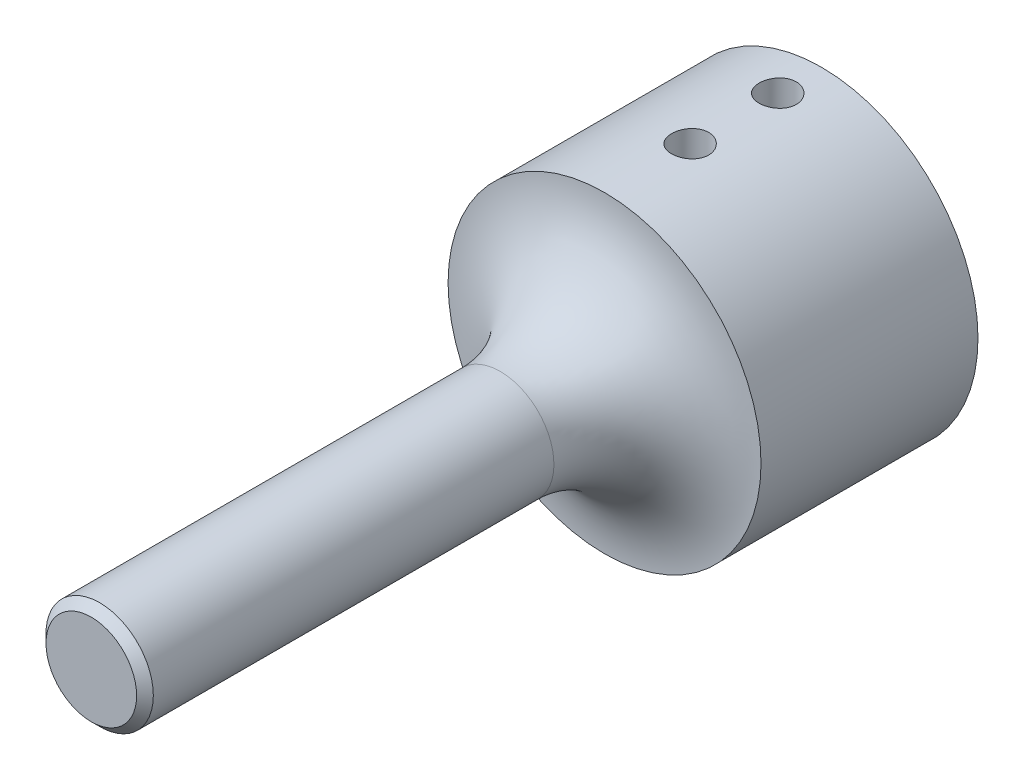
ISO-10303-21;
HEADER;
FILE_DESCRIPTION(('STEP AP214'),'2;1');
FILE_NAME('part.step','',(''),(''),'','','');
FILE_SCHEMA(('AUTOMOTIVE_DESIGN { 1 0 10303 214 1 1 1 1 }'));
ENDSEC;
DATA;
#1=APPLICATION_CONTEXT('core data for automotive mechanical design processes');
#2=APPLICATION_PROTOCOL_DEFINITION('international standard','automotive_design',2000,#1);
#3=PRODUCT_CONTEXT('',#1,'mechanical');
#4=PRODUCT('Part','Part','',(#3));
#5=PRODUCT_RELATED_PRODUCT_CATEGORY('part','',(#4));
#6=PRODUCT_DEFINITION_FORMATION('','',#4);
#7=PRODUCT_DEFINITION_CONTEXT('part definition',#1,'design');
#8=PRODUCT_DEFINITION('design','',#6,#7);
#9=PRODUCT_DEFINITION_SHAPE('','',#8);
#10=(LENGTH_UNIT() NAMED_UNIT(*) SI_UNIT(.MILLI.,.METRE.));
#11=(NAMED_UNIT(*) PLANE_ANGLE_UNIT() SI_UNIT($,.RADIAN.));
#12=(NAMED_UNIT(*) SI_UNIT($,.STERADIAN.) SOLID_ANGLE_UNIT());
#13=UNCERTAINTY_MEASURE_WITH_UNIT(LENGTH_MEASURE(1.E-05),#10,'distance_accuracy_value','');
#14=(GEOMETRIC_REPRESENTATION_CONTEXT(3) GLOBAL_UNCERTAINTY_ASSIGNED_CONTEXT((#13)) GLOBAL_UNIT_ASSIGNED_CONTEXT((#10,
#11,#12)) REPRESENTATION_CONTEXT('',''));
#15=CARTESIAN_POINT('',(0.,0.,0.));
#16=DIRECTION('',(0.,0.,1.));
#17=DIRECTION('',(1.,0.,0.));
#18=AXIS2_PLACEMENT_3D('',#15,#16,#17);
#19=CARTESIAN_POINT('',(-18.0514662573155,-10.8126357882277,-16.91054210806));
#20=DIRECTION('',(0.,0.,-1.));
#21=DIRECTION('',(0.,1.,0.));
#22=AXIS2_PLACEMENT_3D('',#19,#20,#21);
#23=CYLINDRICAL_SURFACE('',#22,9.525);
#24=CARTESIAN_POINT('',(-18.0514662573155,-1.28763578822773,-18.44724210806));
#25=CARTESIAN_POINT('',(-17.9882153197936,-1.28763663343585,-18.447244810517));
#26=CARTESIAN_POINT('',(-17.9249242275658,-1.28827248180843,-18.4525692313038));
#27=CARTESIAN_POINT('',(-17.8001014368434,-1.29074785101325,-18.4737263484268));
#28=CARTESIAN_POINT('',(-17.7385716754113,-1.29258864765316,-18.4895701830467));
#29=CARTESIAN_POINT('',(-17.6190968204405,-1.29726642317237,-18.5312942913642));
#30=CARTESIAN_POINT('',(-17.5611494103104,-1.30010275017836,-18.5571679986558));
#31=CARTESIAN_POINT('',(-17.4504308524692,-1.30645566631574,-18.6182034549146));
#32=CARTESIAN_POINT('',(-17.3976587806049,-1.30997213366083,-18.653363541469));
#33=CARTESIAN_POINT('',(-17.2985144343616,-1.31731196099756,-18.7321612070145));
#34=CARTESIAN_POINT('',(-17.2521716531665,-1.32113661578548,-18.7758357778217));
#35=CARTESIAN_POINT('',(-17.1674552669091,-1.32865124404931,-18.8703433268483));
#36=CARTESIAN_POINT('',(-17.1290820572934,-1.33234121083456,-18.9211766600725));
#37=CARTESIAN_POINT('',(-17.0612855537481,-1.33918151409459,-19.0287486932236));
#38=CARTESIAN_POINT('',(-17.0318896577375,-1.34233018605715,-19.0855047754408));
#39=CARTESIAN_POINT('',(-16.9830571792291,-1.34771454161614,-19.2031914387469));
#40=CARTESIAN_POINT('',(-16.9636202554845,-1.34995025649477,-19.2641218767194));
#41=CARTESIAN_POINT('',(-16.9353465537621,-1.35324333803794,-19.3881227823505));
#42=CARTESIAN_POINT('',(-16.9264601809845,-1.35430621615747,-19.4511817929043));
#43=CARTESIAN_POINT('',(-16.9193864115577,-1.35515020078602,-19.5779044060569));
#44=CARTESIAN_POINT('',(-16.9211986256806,-1.35493135392578,-19.6415679865765));
#45=CARTESIAN_POINT('',(-16.9354298328598,-1.35324165789509,-19.7673479666981));
#46=CARTESIAN_POINT('',(-16.9477943279195,-1.35177724168584,-19.829470631067));
#47=CARTESIAN_POINT('',(-16.9826941477497,-1.34777144491238,-19.9507529755792));
#48=CARTESIAN_POINT('',(-17.0052296599236,-1.34523004450453,-20.0099126011054));
#49=CARTESIAN_POINT('',(-17.0598908215646,-1.33934930322716,-20.1237596299982));
#50=CARTESIAN_POINT('',(-17.092040289182,-1.33600798474456,-20.1784354912851));
#51=CARTESIAN_POINT('',(-17.1649996978145,-1.32890545217908,-20.2816365165216));
#52=CARTESIAN_POINT('',(-17.2058099959676,-1.32514422078372,-20.3301614266986));
#53=CARTESIAN_POINT('',(-17.2952352866473,-1.31759703661084,-20.4199995298958));
#54=CARTESIAN_POINT('',(-17.3438972789469,-1.31381107568362,-20.461265952846));
#55=CARTESIAN_POINT('',(-17.4474824216774,-1.30666296915444,-20.5350519736082));
#56=CARTESIAN_POINT('',(-17.5024055842254,-1.3033008243727,-20.567571554492));
#57=CARTESIAN_POINT('',(-17.6169890650876,-1.29737737231467,-20.622940289348));
#58=CARTESIAN_POINT('',(-17.67665073749,-1.29481629499335,-20.6457866671883));
#59=CARTESIAN_POINT('',(-17.799000598783,-1.29078568548237,-20.6811241265642));
#60=CARTESIAN_POINT('',(-17.8616886599339,-1.2893161072649,-20.6936156447602));
#61=CARTESIAN_POINT('',(-17.9879072465489,-1.28764003929652,-20.7078285311502));
#62=CARTESIAN_POINT('',(-18.0514304173072,-1.2874259902572,-20.7096143575962));
#63=CARTESIAN_POINT('',(-18.1778708891652,-1.28826472654523,-20.7025350521886));
#64=CARTESIAN_POINT('',(-18.2407882018435,-1.28931748761396,-20.6936701242903));
#65=CARTESIAN_POINT('',(-18.3640419077389,-1.29256681601997,-20.6655944831271));
#66=CARTESIAN_POINT('',(-18.4243853641369,-1.29476000152513,-20.6464143529887));
#67=CARTESIAN_POINT('',(-18.5409990115921,-1.30004450792664,-20.5982844561384));
#68=CARTESIAN_POINT('',(-18.5972690768377,-1.3031358565491,-20.5693343878259));
#69=CARTESIAN_POINT('',(-18.7044274964864,-1.30989059125222,-20.5023293800957));
#70=CARTESIAN_POINT('',(-18.755289499798,-1.31355658053019,-20.4642325652899));
#71=CARTESIAN_POINT('',(-18.8499202847191,-1.32104194290352,-20.3800749529435));
#72=CARTESIAN_POINT('',(-18.8936888133888,-1.3248613214624,-20.3340138715332));
#73=CARTESIAN_POINT('',(-18.973117585297,-1.33224616329585,-20.2349520169174));
#74=CARTESIAN_POINT('',(-19.008735214628,-1.33581022804106,-20.1819169561492));
#75=CARTESIAN_POINT('',(-19.0705571391929,-1.34225834136365,-20.0705797375953));
#76=CARTESIAN_POINT('',(-19.0967616072111,-1.34514240242259,-20.0122776765134));
#77=CARTESIAN_POINT('',(-19.1389437222468,-1.34989462430631,-19.8922012983206));
#78=CARTESIAN_POINT('',(-19.1549457581781,-1.35176520623118,-19.8304356487656));
#79=CARTESIAN_POINT('',(-19.1763474829373,-1.35428576046631,-19.7050704814088));
#80=CARTESIAN_POINT('',(-19.1817476125448,-1.35493578352187,-19.6414710399593));
#81=CARTESIAN_POINT('',(-19.1817846904457,-1.35494024853987,-19.5146674655561));
#82=CARTESIAN_POINT('',(-19.1764885818454,-1.35430274854945,-19.4514633419564));
#83=CARTESIAN_POINT('',(-19.1554248971346,-1.35182128191016,-19.3268500942845));
#84=CARTESIAN_POINT('',(-19.139657316609,-1.34997731475262,-19.2654409709691));
#85=CARTESIAN_POINT('',(-19.0981185504269,-1.34529310315644,-19.1461674749464));
#86=CARTESIAN_POINT('',(-19.0723502522068,-1.34245314630564,-19.0883020846602));
#87=CARTESIAN_POINT('',(-19.0115481460035,-1.33609643994807,-18.9777061340658));
#88=CARTESIAN_POINT('',(-18.9765142674556,-1.33257968528701,-18.9249756128678));
#89=CARTESIAN_POINT('',(-18.8979261337611,-1.32523924693353,-18.8258036817852));
#90=CARTESIAN_POINT('',(-18.8543219554093,-1.32141384623853,-18.7794019579957));
#91=CARTESIAN_POINT('',(-18.7599342083051,-1.3139024689342,-18.6945477638902));
#92=CARTESIAN_POINT('',(-18.7091489425004,-1.31021652554352,-18.6560971779109));
#93=CARTESIAN_POINT('',(-18.6016421325572,-1.30338553671744,-18.5881259455954));
#94=CARTESIAN_POINT('',(-18.5449007645963,-1.30024239599414,-18.5586364798392));
#95=CARTESIAN_POINT('',(-18.4272669888281,-1.29487074360418,-18.5096457634046));
#96=CARTESIAN_POINT('',(-18.3663792219865,-1.29264122834002,-18.4901335470647));
#97=CARTESIAN_POINT('',(-18.2628843721093,-1.28989176006893,-18.4663755659465));
#98=CARTESIAN_POINT('',(-18.2209325569325,-1.28904984331134,-18.4592106899935));
#99=CARTESIAN_POINT('',(-18.1364819591754,-1.28792157509874,-18.4496430680201));
#100=CARTESIAN_POINT('',(-18.0939831801019,-1.28763522008361,-18.4472402914837));
#101=CARTESIAN_POINT('',(-18.0514662573155,-1.28763578822773,-18.44724210806));
#102=B_SPLINE_CURVE_WITH_KNOTS('',3,(#24,#25,#26,#27,#28,#29,#30,#31,#32,#33,#34,#35,#36,#37,
#38,#39,#40,#41,#42,#43,#44,#45,#46,#47,#48,#49,#50,#51,#52,#53,#54,#55,#56,#57,#58,#59,#60,#61,
#62,#63,#64,#65,#66,#67,#68,#69,#70,#71,#72,#73,#74,#75,#76,#77,#78,#79,#80,#81,#82,#83,#84,#85,
#86,#87,#88,#89,#90,#91,#92,#93,#94,#95,#96,#97,#98,#99,#100,#101),.UNSPECIFIED.,.T.,.F.,(4,2,2,
2,2,2,2,2,2,2,2,2,2,2,2,2,2,2,2,2,2,2,2,2,2,2,2,2,2,2,2,2,2,2,2,2,2,2,4),(0.,0.189597524312163,
0.379396121234883,0.56907066916994,0.75871128526545,0.949194948105548,1.13968806040505,
1.33075686013229,1.52181911239724,1.71197964005891,1.90213324948718,2.09131069927981,
2.28049163485501,2.4701451964838,2.65980658018673,2.8506485273792,3.04149084391374,
3.232387893604,3.4232768928326,3.61301539850876,3.80275027087081,3.99192568241037,
4.18110693437604,4.37117138460746,4.56124261068453,4.75228593782411,4.94332575806604,
5.13390716820241,5.32448065465381,5.51386512071869,5.70324966663246,5.89257957351564,
6.08191092233626,6.27237971236643,6.4628935899097,6.65406297150348,6.8450217911509,
6.97246899232318,7.09991537679581),.UNSPECIFIED.);
#103=CARTESIAN_POINT('',(-18.0514662573155,-1.28763578822773,-18.44724210806));
#104=VERTEX_POINT('',#103);
#105=EDGE_CURVE('E87',#104,#104,#102,.T.);
#106=ORIENTED_EDGE('',*,*,#105,.F.);
#107=EDGE_LOOP('',(#106));
#108=FACE_BOUND('',#107,.T.);
#109=CARTESIAN_POINT('',(-18.0514662573155,-1.28763578822773,-23.78124210806));
#110=CARTESIAN_POINT('',(-17.9882153197936,-1.28763663343585,-23.781244810517));
#111=CARTESIAN_POINT('',(-17.9249242275658,-1.28827248180843,-23.7865692313038));
#112=CARTESIAN_POINT('',(-17.8001014368434,-1.29074785101325,-23.8077263484268));
#113=CARTESIAN_POINT('',(-17.7385716754113,-1.29258864765316,-23.8235701830467));
#114=CARTESIAN_POINT('',(-17.6190968204405,-1.29726642317237,-23.8652942913642));
#115=CARTESIAN_POINT('',(-17.5611494103104,-1.30010275017836,-23.8911679986558));
#116=CARTESIAN_POINT('',(-17.4504308524692,-1.30645566631574,-23.9522034549146));
#117=CARTESIAN_POINT('',(-17.3976587806049,-1.30997213366083,-23.987363541469));
#118=CARTESIAN_POINT('',(-17.2985144343616,-1.31731196099756,-24.0661612070145));
#119=CARTESIAN_POINT('',(-17.2521716531665,-1.32113661578548,-24.1098357778217));
#120=CARTESIAN_POINT('',(-17.1674552669091,-1.32865124404931,-24.2043433268482));
#121=CARTESIAN_POINT('',(-17.1290820572934,-1.33234121083456,-24.2551766600725));
#122=CARTESIAN_POINT('',(-17.0612855537481,-1.33918151409459,-24.3627486932236));
#123=CARTESIAN_POINT('',(-17.0318896577375,-1.34233018605715,-24.4195047754408));
#124=CARTESIAN_POINT('',(-16.9830571792291,-1.34771454161614,-24.5371914387469));
#125=CARTESIAN_POINT('',(-16.9636202554845,-1.34995025649477,-24.5981218767194));
#126=CARTESIAN_POINT('',(-16.9353465537621,-1.35324333803794,-24.7221227823505));
#127=CARTESIAN_POINT('',(-16.9264601809845,-1.35430621615747,-24.7851817929043));
#128=CARTESIAN_POINT('',(-16.9193864115577,-1.35515020078602,-24.9119044060569));
#129=CARTESIAN_POINT('',(-16.9211986256806,-1.35493135392578,-24.9755679865765));
#130=CARTESIAN_POINT('',(-16.9354298328598,-1.35324165789509,-25.1013479666981));
#131=CARTESIAN_POINT('',(-16.9477943279195,-1.35177724168584,-25.163470631067));
#132=CARTESIAN_POINT('',(-16.9826941477497,-1.34777144491238,-25.2847529755791));
#133=CARTESIAN_POINT('',(-17.0052296599236,-1.34523004450453,-25.3439126011054));
#134=CARTESIAN_POINT('',(-17.0598908215646,-1.33934930322716,-25.4577596299982));
#135=CARTESIAN_POINT('',(-17.092040289182,-1.33600798474456,-25.5124354912851));
#136=CARTESIAN_POINT('',(-17.1649996978145,-1.32890545217908,-25.6156365165216));
#137=CARTESIAN_POINT('',(-17.2058099959676,-1.32514422078372,-25.6641614266986));
#138=CARTESIAN_POINT('',(-17.2952352866473,-1.31759703661084,-25.7539995298958));
#139=CARTESIAN_POINT('',(-17.3438972789469,-1.31381107568362,-25.795265952846));
#140=CARTESIAN_POINT('',(-17.4474824216774,-1.30666296915444,-25.8690519736082));
#141=CARTESIAN_POINT('',(-17.5024055842254,-1.3033008243727,-25.901571554492));
#142=CARTESIAN_POINT('',(-17.6169890650876,-1.29737737231467,-25.956940289348));
#143=CARTESIAN_POINT('',(-17.67665073749,-1.29481629499335,-25.9797866671883));
#144=CARTESIAN_POINT('',(-17.799000598783,-1.29078568548237,-26.0151241265642));
#145=CARTESIAN_POINT('',(-17.8616886599339,-1.2893161072649,-26.0276156447602));
#146=CARTESIAN_POINT('',(-17.9879072465489,-1.28764003929652,-26.0418285311502));
#147=CARTESIAN_POINT('',(-18.0514304173072,-1.2874259902572,-26.0436143575962));
#148=CARTESIAN_POINT('',(-18.1778708891652,-1.28826472654523,-26.0365350521886));
#149=CARTESIAN_POINT('',(-18.2407882018435,-1.28931748761396,-26.0276701242903));
#150=CARTESIAN_POINT('',(-18.3640419077389,-1.29256681601997,-25.9995944831271));
#151=CARTESIAN_POINT('',(-18.4243853641369,-1.29476000152513,-25.9804143529887));
#152=CARTESIAN_POINT('',(-18.5409990115921,-1.30004450792664,-25.9322844561384));
#153=CARTESIAN_POINT('',(-18.5972690768377,-1.3031358565491,-25.9033343878259));
#154=CARTESIAN_POINT('',(-18.7044274964864,-1.30989059125222,-25.8363293800957));
#155=CARTESIAN_POINT('',(-18.755289499798,-1.31355658053019,-25.7982325652899));
#156=CARTESIAN_POINT('',(-18.8499202847191,-1.32104194290352,-25.7140749529435));
#157=CARTESIAN_POINT('',(-18.8936888133888,-1.3248613214624,-25.6680138715332));
#158=CARTESIAN_POINT('',(-18.973117585297,-1.33224616329585,-25.5689520169174));
#159=CARTESIAN_POINT('',(-19.008735214628,-1.33581022804106,-25.5159169561492));
#160=CARTESIAN_POINT('',(-19.0705571391929,-1.34225834136365,-25.4045797375953));
#161=CARTESIAN_POINT('',(-19.0967616072111,-1.34514240242259,-25.3462776765134));
#162=CARTESIAN_POINT('',(-19.1389437222468,-1.34989462430631,-25.2262012983206));
#163=CARTESIAN_POINT('',(-19.1549457581781,-1.35176520623118,-25.1644356487656));
#164=CARTESIAN_POINT('',(-19.1763474829373,-1.35428576046631,-25.0390704814088));
#165=CARTESIAN_POINT('',(-19.1817476125448,-1.35493578352187,-24.9754710399593));
#166=CARTESIAN_POINT('',(-19.1817846904457,-1.35494024853987,-24.8486674655561));
#167=CARTESIAN_POINT('',(-19.1764885818454,-1.35430274854945,-24.7854633419564));
#168=CARTESIAN_POINT('',(-19.1554248971346,-1.35182128191016,-24.6608500942845));
#169=CARTESIAN_POINT('',(-19.139657316609,-1.34997731475262,-24.5994409709691));
#170=CARTESIAN_POINT('',(-19.0981185504269,-1.34529310315644,-24.4801674749464));
#171=CARTESIAN_POINT('',(-19.0723502522068,-1.34245314630564,-24.4223020846602));
#172=CARTESIAN_POINT('',(-19.0115481460035,-1.33609643994807,-24.3117061340658));
#173=CARTESIAN_POINT('',(-18.9765142674556,-1.33257968528701,-24.2589756128678));
#174=CARTESIAN_POINT('',(-18.8979261337611,-1.32523924693353,-24.1598036817852));
#175=CARTESIAN_POINT('',(-18.8543219554093,-1.32141384623853,-24.1134019579957));
#176=CARTESIAN_POINT('',(-18.7599342083051,-1.3139024689342,-24.0285477638902));
#177=CARTESIAN_POINT('',(-18.7091489425004,-1.31021652554352,-23.9900971779109));
#178=CARTESIAN_POINT('',(-18.6016421325572,-1.30338553671744,-23.9221259455954));
#179=CARTESIAN_POINT('',(-18.5449007645963,-1.30024239599414,-23.8926364798392));
#180=CARTESIAN_POINT('',(-18.4272669888281,-1.29487074360418,-23.8436457634046));
#181=CARTESIAN_POINT('',(-18.3663792219865,-1.29264122834002,-23.8241335470647));
#182=CARTESIAN_POINT('',(-18.2628843721093,-1.28989176006893,-23.8003755659465));
#183=CARTESIAN_POINT('',(-18.2209325569325,-1.28904984331134,-23.7932106899935));
#184=CARTESIAN_POINT('',(-18.1364819591754,-1.28792157509874,-23.7836430680201));
#185=CARTESIAN_POINT('',(-18.0939831801019,-1.28763522008361,-23.7812402914837));
#186=CARTESIAN_POINT('',(-18.0514662573155,-1.28763578822773,-23.78124210806));
#187=B_SPLINE_CURVE_WITH_KNOTS('',3,(#109,#110,#111,#112,#113,#114,#115,#116,#117,#118,#119,
#120,#121,#122,#123,#124,#125,#126,#127,#128,#129,#130,#131,#132,#133,#134,#135,#136,#137,#138,
#139,#140,#141,#142,#143,#144,#145,#146,#147,#148,#149,#150,#151,#152,#153,#154,#155,#156,#157,
#158,#159,#160,#161,#162,#163,#164,#165,#166,#167,#168,#169,#170,#171,#172,#173,#174,#175,#176,
#177,#178,#179,#180,#181,#182,#183,#184,#185,#186),.UNSPECIFIED.,.T.,.F.,(4,2,2,2,2,2,2,2,2,2,2,
2,2,2,2,2,2,2,2,2,2,2,2,2,2,2,2,2,2,2,2,2,2,2,2,2,2,2,4),(0.,0.189597524312163,
0.379396121234883,0.56907066916994,0.75871128526545,0.949194948105545,1.13968806040505,
1.33075686013229,1.52181911239724,1.71197964005891,1.90213324948718,2.09131069927981,
2.28049163485501,2.4701451964838,2.65980658018673,2.85064852737921,3.04149084391374,
3.232387893604,3.4232768928326,3.61301539850876,3.80275027087081,3.99192568241037,
4.18110693437604,4.37117138460747,4.56124261068453,4.75228593782411,4.94332575806604,
5.13390716820242,5.32448065465382,5.51386512071869,5.70324966663246,5.89257957351564,
6.08191092233625,6.27237971236643,6.46289358990969,6.65406297150348,6.8450217911509,
6.97246899232318,7.09991537679581),.UNSPECIFIED.);
#188=CARTESIAN_POINT('',(-18.0514662573155,-1.28763578822773,-23.78124210806));
#189=VERTEX_POINT('',#188);
#190=EDGE_CURVE('E100',#189,#189,#187,.T.);
#191=ORIENTED_EDGE('',*,*,#190,.F.);
#192=EDGE_LOOP('',(#191));
#193=FACE_BOUND('',#192,.T.);
#194=CARTESIAN_POINT('',(-18.0514662573155,-10.8126357882277,-14.37054210806));
#195=DIRECTION('',(0.,0.,-1.));
#196=DIRECTION('',(0.,1.,0.));
#197=AXIS2_PLACEMENT_3D('',#194,#195,#196);
#198=CIRCLE('',#197,9.525);
#199=CARTESIAN_POINT('',(-18.0514662573155,-1.28763578822773,-14.37054210806));
#200=VERTEX_POINT('',#199);
#201=EDGE_CURVE('E58',#200,#200,#198,.T.);
#202=ORIENTED_EDGE('',*,*,#201,.T.);
#203=EDGE_LOOP('',(#202));
#204=FACE_BOUND('',#203,.T.);
#205=CARTESIAN_POINT('',(-18.0514662573155,-10.8126357882277,-27.57854210806));
#206=DIRECTION('',(0.,0.,-1.));
#207=DIRECTION('',(0.,1.,0.));
#208=AXIS2_PLACEMENT_3D('',#205,#206,#207);
#209=CIRCLE('',#208,9.525);
#210=CARTESIAN_POINT('',(-18.0514662573155,-1.28763578822773,-27.57854210806));
#211=VERTEX_POINT('',#210);
#212=EDGE_CURVE('E104',#211,#211,#209,.T.);
#213=ORIENTED_EDGE('',*,*,#212,.F.);
#214=EDGE_LOOP('',(#213));
#215=FACE_BOUND('',#214,.T.);
#216=ADVANCED_FACE('F35',(#108,#193,#204,#215),#23,.T.);
#217=CARTESIAN_POINT('',(-18.0514662573155,-1.28763578822773,-27.57854210806));
#218=DIRECTION('',(0.,0.,-1.));
#219=DIRECTION('',(0.,1.,0.));
#220=AXIS2_PLACEMENT_3D('',#217,#218,#219);
#221=PLANE('',#220);
#222=CARTESIAN_POINT('',(-18.0514662573155,-10.8126357882277,-27.57854210806));
#223=DIRECTION('',(0.,0.,-1.));
#224=DIRECTION('',(0.,1.,0.));
#225=AXIS2_PLACEMENT_3D('',#222,#223,#224);
#226=CIRCLE('',#225,7.08149896480335);
#227=CARTESIAN_POINT('',(-18.0514662573155,-3.73113682342438,-27.57854210806));
#228=VERTEX_POINT('',#227);
#229=EDGE_CURVE('E46',#228,#228,#226,.F.);
#230=ORIENTED_EDGE('',*,*,#229,.T.);
#231=EDGE_LOOP('',(#230));
#232=FACE_BOUND('',#231,.T.);
#233=ORIENTED_EDGE('',*,*,#212,.T.);
#234=EDGE_LOOP('',(#233));
#235=FACE_BOUND('',#234,.T.);
#236=ADVANCED_FACE('F96',(#232,#235),#221,.T.);
#237=CARTESIAN_POINT('',(-18.0514662573155,-1.28763578822773,-24.91154210806));
#238=DIRECTION('',(0.,1.,0.));
#239=DIRECTION('',(0.,0.,1.));
#240=AXIS2_PLACEMENT_3D('',#237,#238,#239);
#241=CYLINDRICAL_SURFACE('',#240,1.13029999999999);
#242=CARTESIAN_POINT('',(-18.0514662573155,-4.23913682342442,-23.78124210806));
#243=CARTESIAN_POINT('',(-18.1144578786624,-4.23913792125387,-23.7812446069332));
#244=CARTESIAN_POINT('',(-18.1774831381546,-4.24005167597852,-23.7865256831174));
#245=CARTESIAN_POINT('',(-18.301763964566,-4.24360881546583,-23.8075005030881));
#246=CARTESIAN_POINT('',(-18.3630178846319,-4.24625375898115,-23.8232036310099));
#247=CARTESIAN_POINT('',(-18.481940137001,-4.25297680319383,-23.8645327185057));
#248=CARTESIAN_POINT('',(-18.5396114300091,-4.25705370146188,-23.8901503545831));
#249=CARTESIAN_POINT('',(-18.649830324175,-4.26619313709019,-23.9505590149976));
#250=CARTESIAN_POINT('',(-18.7023784685593,-4.27125556977961,-23.9853490652972));
#251=CARTESIAN_POINT('',(-18.8013995628145,-4.2818629066109,-24.0634903765627));
#252=CARTESIAN_POINT('',(-18.8478129802355,-4.28741177628507,-24.1069165470553));
#253=CARTESIAN_POINT('',(-18.9327326780005,-4.29833646897166,-24.200936168453));
#254=CARTESIAN_POINT('',(-18.9712384431838,-4.30371228069063,-24.2515300859536));
#255=CARTESIAN_POINT('',(-19.0394905938107,-4.31372061675518,-24.3588608648711));
#256=CARTESIAN_POINT('',(-19.0691776962172,-4.31834801934757,-24.4156359440041));
#257=CARTESIAN_POINT('',(-19.1185706126969,-4.32628036540765,-24.5334600204685));
#258=CARTESIAN_POINT('',(-19.1382771457249,-4.3295854041288,-24.5945087095878));
#259=CARTESIAN_POINT('',(-19.1669610978477,-4.33445922363754,-24.7185145021006));
#260=CARTESIAN_POINT('',(-19.1760415574233,-4.3360446680406,-24.7814471035995));
#261=CARTESIAN_POINT('',(-19.1835351664932,-4.33735015308558,-24.9079611132254));
#262=CARTESIAN_POINT('',(-19.1819491195167,-4.33707033424149,-24.97154247212));
#263=CARTESIAN_POINT('',(-19.1682385751941,-4.33469211288448,-25.0968109586283));
#264=CARTESIAN_POINT('',(-19.1562301703462,-4.33261374478979,-25.1585112283933));
#265=CARTESIAN_POINT('',(-19.1221981289686,-4.32690399093259,-25.2790080541543));
#266=CARTESIAN_POINT('',(-19.1001741288373,-4.32327254878825,-25.3378045046455));
#267=CARTESIAN_POINT('',(-19.0466193940015,-4.31484434617926,-25.4511703075551));
#268=CARTESIAN_POINT('',(-19.0150407760635,-4.31004174048118,-25.5057165871771));
#269=CARTESIAN_POINT('',(-18.9433071703256,-4.29981635278166,-25.6087800091358));
#270=CARTESIAN_POINT('',(-18.9031514468458,-4.29439351760013,-25.6572966337288));
#271=CARTESIAN_POINT('',(-18.8147725770591,-4.2834508333179,-25.747595238564));
#272=CARTESIAN_POINT('',(-18.7664498982124,-4.2779306487672,-25.7892798230164));
#273=CARTESIAN_POINT('',(-18.6634445743207,-4.26748135181069,-25.8639640370368));
#274=CARTESIAN_POINT('',(-18.608761883255,-4.2625522436824,-25.8969636037547));
#275=CARTESIAN_POINT('',(-18.4944947706915,-4.25383279833599,-25.9533512304509));
#276=CARTESIAN_POINT('',(-18.4349058346732,-4.2500435252048,-25.9767303167254));
#277=CARTESIAN_POINT('',(-18.312567374041,-4.24403915397088,-26.0131209966668));
#278=CARTESIAN_POINT('',(-18.2498181316032,-4.24182391559232,-26.0261335142006));
#279=CARTESIAN_POINT('',(-18.1237793646166,-4.23923617201866,-26.0412887907926));
#280=CARTESIAN_POINT('',(-18.0605063586039,-4.2388410123352,-26.0435651907253));
#281=CARTESIAN_POINT('',(-17.9344832545408,-4.2398757724221,-26.0375404358427));
#282=CARTESIAN_POINT('',(-17.8717331351345,-4.24130561728339,-26.0292397151756));
#283=CARTESIAN_POINT('',(-17.7489525380507,-4.24581568344713,-26.0024074959001));
#284=CARTESIAN_POINT('',(-17.6889070952313,-4.24888517060159,-25.9839425153386));
#285=CARTESIAN_POINT('',(-17.5727641215821,-4.25633175692114,-25.9373770996028));
#286=CARTESIAN_POINT('',(-17.5166668243849,-4.26070893338888,-25.9092760947907));
#287=CARTESIAN_POINT('',(-17.4094345000714,-4.2703416570466,-25.8439327423608));
#288=CARTESIAN_POINT('',(-17.358350791032,-4.27560503654998,-25.8066073559331));
#289=CARTESIAN_POINT('',(-17.2631242603222,-4.28640361107706,-25.7239885423115));
#290=CARTESIAN_POINT('',(-17.2189819779033,-4.29193882717487,-25.6786944966431));
#291=CARTESIAN_POINT('',(-17.1383929189639,-4.30273094198827,-25.58082330234));
#292=CARTESIAN_POINT('',(-17.1020366642562,-4.30798408496971,-25.5281711359651));
#293=CARTESIAN_POINT('',(-17.038684907849,-4.31754584859737,-25.4174283705016));
#294=CARTESIAN_POINT('',(-17.0116890959091,-4.32185450054585,-25.3593379517381));
#295=CARTESIAN_POINT('',(-16.9679582275494,-4.32901094161527,-25.2396150917425));
#296=CARTESIAN_POINT('',(-16.9511789827378,-4.33186501317765,-25.1779991837404));
#297=CARTESIAN_POINT('',(-16.9282191154981,-4.3358045756215,-25.0527700324229));
#298=CARTESIAN_POINT('',(-16.9220375061823,-4.3368902311834,-24.9891569756507));
#299=CARTESIAN_POINT('',(-16.9204772546174,-4.33716263219644,-24.8626438339364));
#300=CARTESIAN_POINT('',(-16.9249560604244,-4.3363744351246,-24.7997455158491));
#301=CARTESIAN_POINT('',(-16.944280323231,-4.33304301418248,-24.675611861407));
#302=CARTESIAN_POINT('',(-16.9591257402423,-4.33049979708202,-24.6143765186385));
#303=CARTESIAN_POINT('',(-16.9987058351807,-4.32395466821801,-24.495367437805));
#304=CARTESIAN_POINT('',(-17.0234274671701,-4.31995468138082,-24.4375892483379));
#305=CARTESIAN_POINT('',(-17.0820433844822,-4.31094497986872,-24.3269774832781));
#306=CARTESIAN_POINT('',(-17.1159381724917,-4.30593520986176,-24.2741441788777));
#307=CARTESIAN_POINT('',(-17.192443831095,-4.29539137460561,-24.1742031729773));
#308=CARTESIAN_POINT('',(-17.2351593115317,-4.28985149006598,-24.1271761530313));
#309=CARTESIAN_POINT('',(-17.3278737359065,-4.27891733144167,-24.0409089721506));
#310=CARTESIAN_POINT('',(-17.377874355624,-4.27352309119844,-24.0016706077368));
#311=CARTESIAN_POINT('',(-17.4841805085323,-4.26344159191905,-23.9318276088718));
#312=CARTESIAN_POINT('',(-17.5405299583851,-4.25875985969721,-23.9012890099605));
#313=CARTESIAN_POINT('',(-17.6576179475128,-4.25068465930051,-23.8501588519847));
#314=CARTESIAN_POINT('',(-17.7183521075804,-4.24728992636336,-23.8295575218972));
#315=CARTESIAN_POINT('',(-17.8246685124486,-4.24290030414666,-23.8032887603123));
#316=CARTESIAN_POINT('',(-17.8696125190729,-4.24149664473921,-23.795034718331));
#317=CARTESIAN_POINT('',(-17.9601872232556,-4.23961451540063,-23.7840105389699));
#318=CARTESIAN_POINT('',(-18.0058179077248,-4.23913602785667,-23.7812402971932));
#319=CARTESIAN_POINT('',(-18.0514662573155,-4.23913682342442,-23.78124210806));
#320=B_SPLINE_CURVE_WITH_KNOTS('',3,(#242,#243,#244,#245,#246,#247,#248,#249,#250,#251,#252,
#253,#254,#255,#256,#257,#258,#259,#260,#261,#262,#263,#264,#265,#266,#267,#268,#269,#270,#271,
#272,#273,#274,#275,#276,#277,#278,#279,#280,#281,#282,#283,#284,#285,#286,#287,#288,#289,#290,
#291,#292,#293,#294,#295,#296,#297,#298,#299,#300,#301,#302,#303,#304,#305,#306,#307,#308,#309,
#310,#311,#312,#313,#314,#315,#316,#317,#318,#319),.UNSPECIFIED.,.T.,.F.,(4,2,2,2,2,2,2,2,2,2,2,
2,2,2,2,2,2,2,2,2,2,2,2,2,2,2,2,2,2,2,2,2,2,2,2,2,2,2,4),(0.,0.188807986854246,
0.377786209654202,0.56660612309961,0.755405993441521,0.94592116780143,1.13644874974253,
1.32822957460904,1.51999658249248,1.7098882083219,1.89976552939967,2.08755460162837,
2.27535049181184,2.46410356910595,2.6528728427311,2.84413492927987,3.03539839987924,
3.2268398732666,3.41826428351104,3.60729948124027,3.79632692008644,3.98413176393884,
4.17194771187092,4.36152026023441,4.55110752845958,4.74279184774956,4.93446981329122,
5.12531273824358,5.31613789028886,5.50442567862923,5.69271274067223,5.88075190390827,
6.0688013737353,6.25922429375179,6.44969108555602,6.64156727468141,6.83325441107427,
6.97008113323837,7.10690525055997),.UNSPECIFIED.);
#321=CARTESIAN_POINT('',(-18.0514662573155,-4.23913682342442,-23.78124210806));
#322=VERTEX_POINT('',#321);
#323=EDGE_CURVE('E66',#322,#322,#320,.T.);
#324=ORIENTED_EDGE('',*,*,#323,.T.);
#325=EDGE_LOOP('',(#324));
#326=FACE_BOUND('',#325,.T.);
#327=ORIENTED_EDGE('',*,*,#190,.T.);
#328=EDGE_LOOP('',(#327));
#329=FACE_BOUND('',#328,.T.);
#330=ADVANCED_FACE('F92',(#326,#329),#241,.F.);
#331=CARTESIAN_POINT('',(-18.0514662573155,-1.28763578822773,-19.57754210806));
#332=DIRECTION('',(0.,1.,0.));
#333=DIRECTION('',(0.,0.,1.));
#334=AXIS2_PLACEMENT_3D('',#331,#332,#333);
#335=CYLINDRICAL_SURFACE('',#334,1.13029999999999);
#336=CARTESIAN_POINT('',(-18.0514662573155,-4.23913682342442,-18.44724210806));
#337=CARTESIAN_POINT('',(-18.1144578786624,-4.23913792125387,-18.4472446069332));
#338=CARTESIAN_POINT('',(-18.1774831381546,-4.24005167597852,-18.4525256831174));
#339=CARTESIAN_POINT('',(-18.301763964566,-4.24360881546583,-18.4735005030881));
#340=CARTESIAN_POINT('',(-18.3630178846319,-4.24625375898115,-18.4892036310099));
#341=CARTESIAN_POINT('',(-18.481940137001,-4.25297680319383,-18.5305327185058));
#342=CARTESIAN_POINT('',(-18.5396114300091,-4.25705370146188,-18.5561503545831));
#343=CARTESIAN_POINT('',(-18.649830324175,-4.26619313709019,-18.6165590149976));
#344=CARTESIAN_POINT('',(-18.7023784685593,-4.27125556977961,-18.6513490652972));
#345=CARTESIAN_POINT('',(-18.8013995628145,-4.2818629066109,-18.7294903765627));
#346=CARTESIAN_POINT('',(-18.8478129802355,-4.28741177628507,-18.7729165470553));
#347=CARTESIAN_POINT('',(-18.9327326780005,-4.29833646897166,-18.866936168453));
#348=CARTESIAN_POINT('',(-18.9712384431838,-4.30371228069063,-18.9175300859536));
#349=CARTESIAN_POINT('',(-19.0394905938107,-4.31372061675518,-19.0248608648711));
#350=CARTESIAN_POINT('',(-19.0691776962172,-4.31834801934757,-19.0816359440041));
#351=CARTESIAN_POINT('',(-19.1185706126969,-4.32628036540765,-19.1994600204686));
#352=CARTESIAN_POINT('',(-19.1382771457249,-4.32958540412881,-19.2605087095878));
#353=CARTESIAN_POINT('',(-19.1669610978477,-4.33445922363754,-19.3845145021006));
#354=CARTESIAN_POINT('',(-19.1760415574233,-4.3360446680406,-19.4474471035995));
#355=CARTESIAN_POINT('',(-19.1835351664932,-4.33735015308559,-19.5739611132254));
#356=CARTESIAN_POINT('',(-19.1819491195167,-4.33707033424149,-19.63754247212));
#357=CARTESIAN_POINT('',(-19.1682385751941,-4.33469211288448,-19.7628109586283));
#358=CARTESIAN_POINT('',(-19.1562301703462,-4.33261374478979,-19.8245112283933));
#359=CARTESIAN_POINT('',(-19.1221981289686,-4.32690399093259,-19.9450080541543));
#360=CARTESIAN_POINT('',(-19.1001741288373,-4.32327254878825,-20.0038045046455));
#361=CARTESIAN_POINT('',(-19.0466193940015,-4.31484434617926,-20.1171703075551));
#362=CARTESIAN_POINT('',(-19.0150407760635,-4.31004174048118,-20.1717165871771));
#363=CARTESIAN_POINT('',(-18.9433071703256,-4.29981635278166,-20.2747800091358));
#364=CARTESIAN_POINT('',(-18.9031514468459,-4.29439351760014,-20.3232966337288));
#365=CARTESIAN_POINT('',(-18.8147725770591,-4.2834508333179,-20.413595238564));
#366=CARTESIAN_POINT('',(-18.7664498982124,-4.2779306487672,-20.4552798230164));
#367=CARTESIAN_POINT('',(-18.6634445743207,-4.26748135181069,-20.5299640370368));
#368=CARTESIAN_POINT('',(-18.608761883255,-4.2625522436824,-20.5629636037547));
#369=CARTESIAN_POINT('',(-18.4944947706915,-4.25383279833599,-20.6193512304509));
#370=CARTESIAN_POINT('',(-18.4349058346732,-4.25004352520481,-20.6427303167254));
#371=CARTESIAN_POINT('',(-18.312567374041,-4.24403915397088,-20.6791209966668));
#372=CARTESIAN_POINT('',(-18.2498181316032,-4.24182391559232,-20.6921335142006));
#373=CARTESIAN_POINT('',(-18.1237793646166,-4.23923617201866,-20.7072887907926));
#374=CARTESIAN_POINT('',(-18.0605063586039,-4.2388410123352,-20.7095651907253));
#375=CARTESIAN_POINT('',(-17.9344832545408,-4.2398757724221,-20.7035404358427));
#376=CARTESIAN_POINT('',(-17.8717331351345,-4.24130561728339,-20.6952397151756));
#377=CARTESIAN_POINT('',(-17.7489525380507,-4.24581568344713,-20.6684074959001));
#378=CARTESIAN_POINT('',(-17.6889070952313,-4.24888517060159,-20.6499425153386));
#379=CARTESIAN_POINT('',(-17.5727641215821,-4.25633175692114,-20.6033770996028));
#380=CARTESIAN_POINT('',(-17.5166668243849,-4.26070893338888,-20.5752760947907));
#381=CARTESIAN_POINT('',(-17.4094345000714,-4.2703416570466,-20.5099327423608));
#382=CARTESIAN_POINT('',(-17.358350791032,-4.27560503654998,-20.4726073559331));
#383=CARTESIAN_POINT('',(-17.2631242603222,-4.28640361107706,-20.3899885423115));
#384=CARTESIAN_POINT('',(-17.2189819779033,-4.29193882717487,-20.3446944966431));
#385=CARTESIAN_POINT('',(-17.1383929189639,-4.30273094198827,-20.24682330234));
#386=CARTESIAN_POINT('',(-17.1020366642562,-4.30798408496971,-20.1941711359651));
#387=CARTESIAN_POINT('',(-17.038684907849,-4.31754584859737,-20.0834283705016));
#388=CARTESIAN_POINT('',(-17.0116890959091,-4.32185450054585,-20.0253379517381));
#389=CARTESIAN_POINT('',(-16.9679582275494,-4.32901094161527,-19.9056150917425));
#390=CARTESIAN_POINT('',(-16.9511789827378,-4.33186501317765,-19.8439991837404));
#391=CARTESIAN_POINT('',(-16.9282191154981,-4.3358045756215,-19.7187700324229));
#392=CARTESIAN_POINT('',(-16.9220375061823,-4.3368902311834,-19.6551569756507));
#393=CARTESIAN_POINT('',(-16.9204772546174,-4.33716263219644,-19.5286438339364));
#394=CARTESIAN_POINT('',(-16.9249560604244,-4.3363744351246,-19.4657455158491));
#395=CARTESIAN_POINT('',(-16.944280323231,-4.33304301418248,-19.341611861407));
#396=CARTESIAN_POINT('',(-16.9591257402423,-4.33049979708202,-19.2803765186385));
#397=CARTESIAN_POINT('',(-16.9987058351807,-4.32395466821801,-19.161367437805));
#398=CARTESIAN_POINT('',(-17.0234274671701,-4.31995468138082,-19.1035892483379));
#399=CARTESIAN_POINT('',(-17.0820433844822,-4.31094497986872,-18.9929774832781));
#400=CARTESIAN_POINT('',(-17.1159381724917,-4.30593520986176,-18.9401441788777));
#401=CARTESIAN_POINT('',(-17.192443831095,-4.29539137460561,-18.8402031729773));
#402=CARTESIAN_POINT('',(-17.2351593115317,-4.28985149006598,-18.7931761530313));
#403=CARTESIAN_POINT('',(-17.3278737359065,-4.27891733144167,-18.7069089721506));
#404=CARTESIAN_POINT('',(-17.377874355624,-4.27352309119844,-18.6676706077368));
#405=CARTESIAN_POINT('',(-17.4841805085323,-4.26344159191905,-18.5978276088718));
#406=CARTESIAN_POINT('',(-17.5405299583851,-4.25875985969721,-18.5672890099605));
#407=CARTESIAN_POINT('',(-17.6576179475128,-4.25068465930051,-18.5161588519847));
#408=CARTESIAN_POINT('',(-17.7183521075804,-4.24728992636336,-18.4955575218972));
#409=CARTESIAN_POINT('',(-17.8246685124486,-4.24290030414666,-18.4692887603123));
#410=CARTESIAN_POINT('',(-17.8696125190729,-4.24149664473921,-18.461034718331));
#411=CARTESIAN_POINT('',(-17.9601872232556,-4.23961451540063,-18.4500105389699));
#412=CARTESIAN_POINT('',(-18.0058179077248,-4.23913602785667,-18.4472402971932));
#413=CARTESIAN_POINT('',(-18.0514662573155,-4.23913682342442,-18.44724210806));
#414=B_SPLINE_CURVE_WITH_KNOTS('',3,(#336,#337,#338,#339,#340,#341,#342,#343,#344,#345,#346,
#347,#348,#349,#350,#351,#352,#353,#354,#355,#356,#357,#358,#359,#360,#361,#362,#363,#364,#365,
#366,#367,#368,#369,#370,#371,#372,#373,#374,#375,#376,#377,#378,#379,#380,#381,#382,#383,#384,
#385,#386,#387,#388,#389,#390,#391,#392,#393,#394,#395,#396,#397,#398,#399,#400,#401,#402,#403,
#404,#405,#406,#407,#408,#409,#410,#411,#412,#413),.UNSPECIFIED.,.T.,.F.,(4,2,2,2,2,2,2,2,2,2,2,
2,2,2,2,2,2,2,2,2,2,2,2,2,2,2,2,2,2,2,2,2,2,2,2,2,2,2,4),(0.,0.188807986854246,
0.377786209654202,0.56660612309961,0.755405993441521,0.94592116780143,1.13644874974253,
1.32822957460904,1.51999658249248,1.7098882083219,1.89976552939967,2.08755460162837,
2.27535049181184,2.46410356910595,2.6528728427311,2.84413492927987,3.03539839987924,
3.2268398732666,3.41826428351104,3.60729948124027,3.79632692008644,3.98413176393884,
4.17194771187092,4.36152026023441,4.55110752845958,4.74279184774956,4.93446981329122,
5.12531273824358,5.31613789028886,5.50442567862923,5.69271274067223,5.88075190390827,
6.0688013737353,6.25922429375179,6.44969108555602,6.64156727468141,6.83325441107427,
6.97008113323837,7.10690525055997),.UNSPECIFIED.);
#415=CARTESIAN_POINT('',(-18.0514662573155,-4.23913682342442,-18.44724210806));
#416=VERTEX_POINT('',#415);
#417=EDGE_CURVE('E59',#416,#416,#414,.T.);
#418=ORIENTED_EDGE('',*,*,#417,.T.);
#419=EDGE_LOOP('',(#418));
#420=FACE_BOUND('',#419,.T.);
#421=ORIENTED_EDGE('',*,*,#105,.T.);
#422=EDGE_LOOP('',(#421));
#423=FACE_BOUND('',#422,.T.);
#424=ADVANCED_FACE('F69',(#420,#423),#335,.F.);
#425=CARTESIAN_POINT('',(-18.0514662573155,-10.8126357882277,26.1104045185544));
#426=DIRECTION('',(0.,0.,-1.));
#427=DIRECTION('',(-1.,0.,0.));
#428=AXIS2_PLACEMENT_3D('',#425,#426,#427);
#429=CYLINDRICAL_SURFACE('',#428,3.26646090534979);
#430=CARTESIAN_POINT('',(-18.0514662573155,-10.8126357882277,16.36345789194));
#431=DIRECTION('',(0.,0.,1.));
#432=DIRECTION('',(1.,0.,0.));
#433=AXIS2_PLACEMENT_3D('',#430,#431,#432);
#434=CIRCLE('',#433,3.26646090534979);
#435=CARTESIAN_POINT('',(-14.7850053519657,-10.8126357882277,16.36345789194));
#436=VERTEX_POINT('',#435);
#437=EDGE_CURVE('E10',#436,#436,#434,.F.);
#438=ORIENTED_EDGE('',*,*,#437,.T.);
#439=EDGE_LOOP('',(#438));
#440=FACE_BOUND('',#439,.T.);
#441=CARTESIAN_POINT('',(-18.0514662573155,-10.8126357882277,-8.021200811296));
#442=DIRECTION('',(0.,0.,-1.));
#443=DIRECTION('',(0.,1.,0.));
#444=AXIS2_PLACEMENT_3D('',#441,#442,#443);
#445=CIRCLE('',#444,3.26646090534979);
#446=CARTESIAN_POINT('',(-18.0514662573155,-7.54617488287794,-8.021200811296));
#447=VERTEX_POINT('',#446);
#448=EDGE_CURVE('E55',#447,#447,#445,.F.);
#449=ORIENTED_EDGE('',*,*,#448,.T.);
#450=EDGE_LOOP('',(#449));
#451=FACE_BOUND('',#450,.T.);
#452=ADVANCED_FACE('F79',(#440,#451),#429,.T.);
#453=CARTESIAN_POINT('',(-18.0514662573155,-10.8126357882277,16.87145789194));
#454=DIRECTION('',(0.,0.,1.));
#455=DIRECTION('',(0.,-1.,0.));
#456=AXIS2_PLACEMENT_3D('',#453,#454,#455);
#457=PLANE('',#456);
#458=CARTESIAN_POINT('',(-18.0514662573155,-10.8126357882277,16.87145789194));
#459=DIRECTION('',(0.,0.,1.));
#460=DIRECTION('',(0.,-1.,0.));
#461=AXIS2_PLACEMENT_3D('',#458,#459,#460);
#462=CIRCLE('',#461,2.7584609053498);
#463=CARTESIAN_POINT('',(-18.0514662573155,-13.5710966935775,16.87145789194));
#464=VERTEX_POINT('',#463);
#465=EDGE_CURVE('E42',#464,#464,#462,.T.);
#466=ORIENTED_EDGE('',*,*,#465,.T.);
#467=EDGE_LOOP('',(#466));
#468=FACE_BOUND('',#467,.T.);
#469=ADVANCED_FACE('F77',(#468),#457,.T.);
#470=CARTESIAN_POINT('',(-18.0514662573155,-10.8126357882277,1.6821206684807));
#471=DIRECTION('',(0.,0.,-1.));
#472=DIRECTION('',(0.,1.,0.));
#473=AXIS2_PLACEMENT_3D('',#470,#471,#472);
#474=CYLINDRICAL_SURFACE('',#473,6.57349896480331);
#475=CARTESIAN_POINT('',(-18.0514662573155,-10.8126357882277,-27.07054210806));
#476=DIRECTION('',(0.,0.,-1.));
#477=DIRECTION('',(-1.,0.,0.));
#478=AXIS2_PLACEMENT_3D('',#475,#476,#477);
#479=CIRCLE('',#478,6.57349896480331);
#480=CARTESIAN_POINT('',(-24.6249652221188,-10.8126357882277,-27.07054210806));
#481=VERTEX_POINT('',#480);
#482=EDGE_CURVE('E50',#481,#481,#479,.T.);
#483=ORIENTED_EDGE('',*,*,#482,.T.);
#484=EDGE_LOOP('',(#483));
#485=FACE_BOUND('',#484,.T.);
#486=ORIENTED_EDGE('',*,*,#417,.F.);
#487=EDGE_LOOP('',(#486));
#488=FACE_BOUND('',#487,.T.);
#489=CARTESIAN_POINT('',(-18.0514662573155,-10.8126357882277,-16.91054210806));
#490=DIRECTION('',(0.,0.,-1.));
#491=DIRECTION('',(0.,1.,0.));
#492=AXIS2_PLACEMENT_3D('',#489,#490,#491);
#493=CIRCLE('',#492,6.57349896480331);
#494=CARTESIAN_POINT('',(-18.0514662573155,-4.23913682342442,-16.91054210806));
#495=VERTEX_POINT('',#494);
#496=EDGE_CURVE('E67',#495,#495,#493,.F.);
#497=ORIENTED_EDGE('',*,*,#496,.T.);
#498=EDGE_LOOP('',(#497));
#499=FACE_BOUND('',#498,.T.);
#500=ORIENTED_EDGE('',*,*,#323,.F.);
#501=EDGE_LOOP('',(#500));
#502=FACE_BOUND('',#501,.T.);
#503=ADVANCED_FACE('F73',(#485,#488,#499,#502),#474,.F.);
#504=CARTESIAN_POINT('',(-18.0514662573155,-4.46263578822773,-16.91054210806));
#505=DIRECTION('',(0.,0.,-1.));
#506=DIRECTION('',(0.,1.,0.));
#507=AXIS2_PLACEMENT_3D('',#504,#505,#506);
#508=PLANE('',#507);
#509=ORIENTED_EDGE('',*,*,#496,.F.);
#510=EDGE_LOOP('',(#509));
#511=FACE_BOUND('',#510,.T.);
#512=ADVANCED_FACE('F76',(#511),#508,.T.);
#513=CARTESIAN_POINT('',(-18.0514662573155,-10.8126357882277,-8.021200811296));
#514=DIRECTION('',(0.,0.,-1.));
#515=DIRECTION('',(0.,1.,0.));
#516=AXIS2_PLACEMENT_3D('',#513,#514,#515);
#517=TOROIDAL_SURFACE('',#516,9.61646090534979,6.35);
#518=ORIENTED_EDGE('',*,*,#201,.F.);
#519=EDGE_LOOP('',(#518));
#520=FACE_BOUND('',#519,.T.);
#521=ORIENTED_EDGE('',*,*,#448,.F.);
#522=EDGE_LOOP('',(#521));
#523=FACE_BOUND('',#522,.T.);
#524=ADVANCED_FACE('F112',(#520,#523),#517,.F.);
#525=CARTESIAN_POINT('',(-18.0514662573155,-10.8126357882277,-27.07054210806));
#526=DIRECTION('',(0.,0.,-1.));
#527=DIRECTION('',(-1.,0.,0.));
#528=AXIS2_PLACEMENT_3D('',#525,#526,#527);
#529=CONICAL_SURFACE('',#528,6.57349896480331,0.785398163397449);
#530=ORIENTED_EDGE('',*,*,#229,.F.);
#531=EDGE_LOOP('',(#530));
#532=FACE_BOUND('',#531,.T.);
#533=ORIENTED_EDGE('',*,*,#482,.F.);
#534=EDGE_LOOP('',(#533));
#535=FACE_BOUND('',#534,.T.);
#536=ADVANCED_FACE('F114',(#532,#535),#529,.F.);
#537=CARTESIAN_POINT('',(-18.0514662573155,-10.8126357882277,16.87145789194));
#538=DIRECTION('',(0.,0.,-1.));
#539=DIRECTION('',(-1.,0.,0.));
#540=AXIS2_PLACEMENT_3D('',#537,#538,#539);
#541=CONICAL_SURFACE('',#540,2.7584609053498,0.785398163397449);
#542=ORIENTED_EDGE('',*,*,#437,.F.);
#543=EDGE_LOOP('',(#542));
#544=FACE_BOUND('',#543,.T.);
#545=ORIENTED_EDGE('',*,*,#465,.F.);
#546=EDGE_LOOP('',(#545));
#547=FACE_BOUND('',#546,.T.);
#548=ADVANCED_FACE('F37',(#544,#547),#541,.T.);
#549=CLOSED_SHELL('',(#216,#236,#330,#424,#452,#469,#503,#512,#524,#536,#548));
#550=MANIFOLD_SOLID_BREP('B2',#549);
#551=ADVANCED_BREP_SHAPE_REPRESENTATION('',(#18,#550),#14);
#552=SHAPE_DEFINITION_REPRESENTATION(#9,#551);
ENDSEC;
END-ISO-10303-21;
